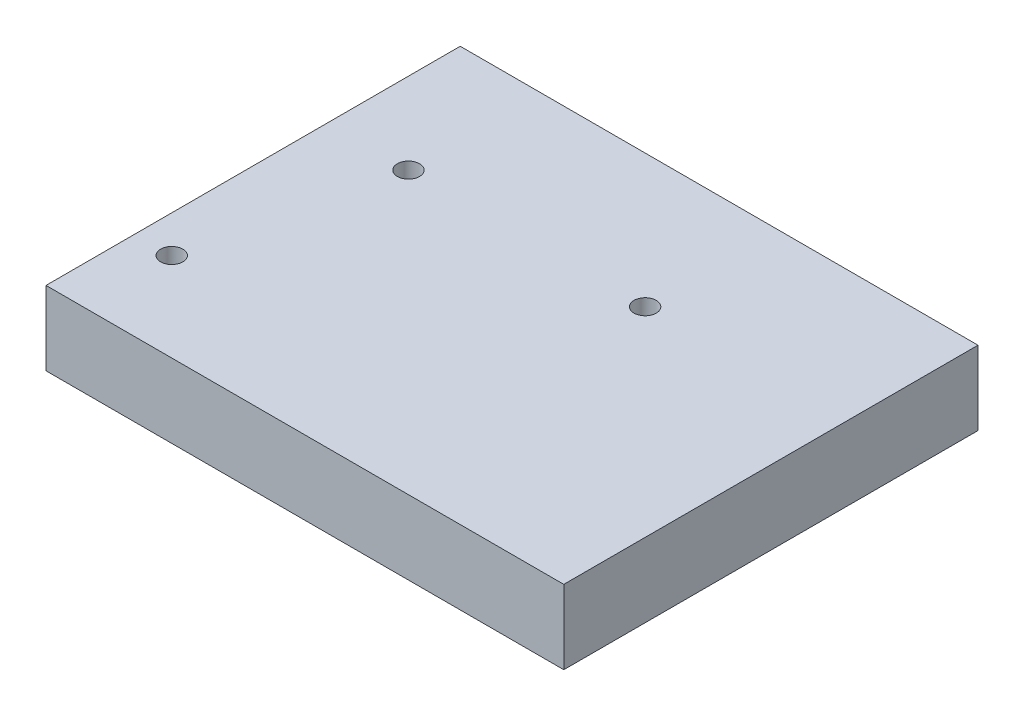
ISO-10303-21;
HEADER;
FILE_DESCRIPTION(('STEP AP214'),'2;1');
FILE_NAME('part.step','',(''),(''),'','','');
FILE_SCHEMA(('AUTOMOTIVE_DESIGN { 1 0 10303 214 1 1 1 1 }'));
ENDSEC;
DATA;
#1=APPLICATION_CONTEXT('core data for automotive mechanical design processes');
#2=APPLICATION_PROTOCOL_DEFINITION('international standard','automotive_design',2000,#1);
#3=PRODUCT_CONTEXT('',#1,'mechanical');
#4=PRODUCT('Part','Part','',(#3));
#5=PRODUCT_RELATED_PRODUCT_CATEGORY('part','',(#4));
#6=PRODUCT_DEFINITION_FORMATION('','',#4);
#7=PRODUCT_DEFINITION_CONTEXT('part definition',#1,'design');
#8=PRODUCT_DEFINITION('design','',#6,#7);
#9=PRODUCT_DEFINITION_SHAPE('','',#8);
#10=(LENGTH_UNIT() NAMED_UNIT(*) SI_UNIT(.MILLI.,.METRE.));
#11=(NAMED_UNIT(*) PLANE_ANGLE_UNIT() SI_UNIT($,.RADIAN.));
#12=(NAMED_UNIT(*) SI_UNIT($,.STERADIAN.) SOLID_ANGLE_UNIT());
#13=UNCERTAINTY_MEASURE_WITH_UNIT(LENGTH_MEASURE(1.E-05),#10,'distance_accuracy_value','');
#14=(GEOMETRIC_REPRESENTATION_CONTEXT(3) GLOBAL_UNCERTAINTY_ASSIGNED_CONTEXT((#13)) GLOBAL_UNIT_ASSIGNED_CONTEXT((#10,
#11,#12)) REPRESENTATION_CONTEXT('',''));
#15=CARTESIAN_POINT('',(0.,0.,0.));
#16=DIRECTION('',(0.,0.,1.));
#17=DIRECTION('',(1.,0.,0.));
#18=AXIS2_PLACEMENT_3D('',#15,#16,#17);
#19=CARTESIAN_POINT('',(35.,10.,-28.));
#20=DIRECTION('',(-1.,0.,0.));
#21=DIRECTION('',(0.,0.,1.));
#22=AXIS2_PLACEMENT_3D('',#19,#20,#21);
#23=PLANE('',#22);
#24=DIRECTION('',(0.,0.,-1.));
#25=VECTOR('',#24,1.);
#26=CARTESIAN_POINT('',(35.,0.,-28.));
#27=LINE('',#26,#25);
#28=CARTESIAN_POINT('',(35.,0.,28.));
#29=VERTEX_POINT('',#28);
#30=CARTESIAN_POINT('',(35.,0.,-28.));
#31=VERTEX_POINT('',#30);
#32=EDGE_CURVE('E102',#29,#31,#27,.T.);
#33=ORIENTED_EDGE('',*,*,#32,.T.);
#34=DIRECTION('',(0.,-1.,0.));
#35=VECTOR('',#34,1.);
#36=CARTESIAN_POINT('',(35.,10.,-28.));
#37=LINE('',#36,#35);
#38=CARTESIAN_POINT('',(35.,10.,-28.));
#39=VERTEX_POINT('',#38);
#40=EDGE_CURVE('E11',#39,#31,#37,.T.);
#41=ORIENTED_EDGE('',*,*,#40,.F.);
#42=DIRECTION('',(0.,0.,-1.));
#43=VECTOR('',#42,1.);
#44=CARTESIAN_POINT('',(35.,10.,-28.));
#45=LINE('',#44,#43);
#46=CARTESIAN_POINT('',(35.,10.,28.));
#47=VERTEX_POINT('',#46);
#48=EDGE_CURVE('E90',#47,#39,#45,.T.);
#49=ORIENTED_EDGE('',*,*,#48,.F.);
#50=DIRECTION('',(0.,-1.,0.));
#51=VECTOR('',#50,1.);
#52=CARTESIAN_POINT('',(35.,10.,28.));
#53=LINE('',#52,#51);
#54=EDGE_CURVE('E98',#47,#29,#53,.T.);
#55=ORIENTED_EDGE('',*,*,#54,.T.);
#56=EDGE_LOOP('',(#33,#41,#49,#55));
#57=FACE_BOUND('',#56,.T.);
#58=ADVANCED_FACE('F39',(#57),#23,.F.);
#59=CARTESIAN_POINT('',(-35.,10.,-28.));
#60=DIRECTION('',(0.,0.,1.));
#61=DIRECTION('',(1.,0.,0.));
#62=AXIS2_PLACEMENT_3D('',#59,#60,#61);
#63=PLANE('',#62);
#64=DIRECTION('',(-1.,0.,0.));
#65=VECTOR('',#64,1.);
#66=CARTESIAN_POINT('',(-35.,0.,-28.));
#67=LINE('',#66,#65);
#68=CARTESIAN_POINT('',(-35.,0.,-28.));
#69=VERTEX_POINT('',#68);
#70=EDGE_CURVE('E94',#31,#69,#67,.T.);
#71=ORIENTED_EDGE('',*,*,#70,.T.);
#72=DIRECTION('',(0.,-1.,0.));
#73=VECTOR('',#72,1.);
#74=CARTESIAN_POINT('',(-35.,10.,-28.));
#75=LINE('',#74,#73);
#76=CARTESIAN_POINT('',(-35.,10.,-28.));
#77=VERTEX_POINT('',#76);
#78=EDGE_CURVE('E47',#77,#69,#75,.T.);
#79=ORIENTED_EDGE('',*,*,#78,.F.);
#80=DIRECTION('',(-1.,0.,0.));
#81=VECTOR('',#80,1.);
#82=CARTESIAN_POINT('',(-35.,10.,-28.));
#83=LINE('',#82,#81);
#84=EDGE_CURVE('E85',#39,#77,#83,.T.);
#85=ORIENTED_EDGE('',*,*,#84,.F.);
#86=ORIENTED_EDGE('',*,*,#40,.T.);
#87=EDGE_LOOP('',(#71,#79,#85,#86));
#88=FACE_BOUND('',#87,.T.);
#89=ADVANCED_FACE('F93',(#88),#63,.F.);
#90=CARTESIAN_POINT('',(-35.,10.,-28.));
#91=DIRECTION('',(1.,0.,0.));
#92=DIRECTION('',(0.,0.,-1.));
#93=AXIS2_PLACEMENT_3D('',#90,#91,#92);
#94=PLANE('',#93);
#95=DIRECTION('',(0.,0.,1.));
#96=VECTOR('',#95,1.);
#97=CARTESIAN_POINT('',(-35.,0.,-28.));
#98=LINE('',#97,#96);
#99=CARTESIAN_POINT('',(-35.,0.,28.));
#100=VERTEX_POINT('',#99);
#101=EDGE_CURVE('E72',#69,#100,#98,.T.);
#102=ORIENTED_EDGE('',*,*,#101,.T.);
#103=DIRECTION('',(0.,-1.,0.));
#104=VECTOR('',#103,1.);
#105=CARTESIAN_POINT('',(-35.,10.,28.));
#106=LINE('',#105,#104);
#107=CARTESIAN_POINT('',(-35.,10.,28.));
#108=VERTEX_POINT('',#107);
#109=EDGE_CURVE('E95',#108,#100,#106,.T.);
#110=ORIENTED_EDGE('',*,*,#109,.F.);
#111=DIRECTION('',(0.,0.,1.));
#112=VECTOR('',#111,1.);
#113=CARTESIAN_POINT('',(-35.,10.,-28.));
#114=LINE('',#113,#112);
#115=EDGE_CURVE('E88',#77,#108,#114,.T.);
#116=ORIENTED_EDGE('',*,*,#115,.F.);
#117=ORIENTED_EDGE('',*,*,#78,.T.);
#118=EDGE_LOOP('',(#102,#110,#116,#117));
#119=FACE_BOUND('',#118,.T.);
#120=ADVANCED_FACE('F96',(#119),#94,.F.);
#121=CARTESIAN_POINT('',(-35.,10.,28.));
#122=DIRECTION('',(0.,0.,-1.));
#123=DIRECTION('',(-1.,0.,0.));
#124=AXIS2_PLACEMENT_3D('',#121,#122,#123);
#125=PLANE('',#124);
#126=DIRECTION('',(1.,0.,0.));
#127=VECTOR('',#126,1.);
#128=CARTESIAN_POINT('',(-35.,0.,28.));
#129=LINE('',#128,#127);
#130=EDGE_CURVE('E78',#100,#29,#129,.T.);
#131=ORIENTED_EDGE('',*,*,#130,.T.);
#132=ORIENTED_EDGE('',*,*,#54,.F.);
#133=DIRECTION('',(1.,0.,0.));
#134=VECTOR('',#133,1.);
#135=CARTESIAN_POINT('',(-35.,10.,28.));
#136=LINE('',#135,#134);
#137=EDGE_CURVE('E55',#108,#47,#136,.T.);
#138=ORIENTED_EDGE('',*,*,#137,.F.);
#139=ORIENTED_EDGE('',*,*,#109,.T.);
#140=EDGE_LOOP('',(#131,#132,#138,#139));
#141=FACE_BOUND('',#140,.T.);
#142=ADVANCED_FACE('F110',(#141),#125,.F.);
#143=CARTESIAN_POINT('',(0.,10.,0.));
#144=DIRECTION('',(0.,1.,0.));
#145=DIRECTION('',(0.,0.,1.));
#146=AXIS2_PLACEMENT_3D('',#143,#144,#145);
#147=PLANE('',#146);
#148=CARTESIAN_POINT('',(-30.,10.,16.));
#149=DIRECTION('',(0.,1.,0.));
#150=DIRECTION('',(0.,0.,1.));
#151=AXIS2_PLACEMENT_3D('',#148,#149,#150);
#152=CIRCLE('',#151,1.5);
#153=CARTESIAN_POINT('',(-30.,10.,17.5));
#154=VERTEX_POINT('',#153);
#155=EDGE_CURVE('E128',#154,#154,#152,.T.);
#156=ORIENTED_EDGE('',*,*,#155,.F.);
#157=EDGE_LOOP('',(#156));
#158=FACE_BOUND('',#157,.T.);
#159=CARTESIAN_POINT('',(-24.,10.,-10.));
#160=DIRECTION('',(0.,1.,0.));
#161=DIRECTION('',(0.,0.,1.));
#162=AXIS2_PLACEMENT_3D('',#159,#160,#161);
#163=CIRCLE('',#162,1.5);
#164=CARTESIAN_POINT('',(-24.,10.,-8.50000000000001));
#165=VERTEX_POINT('',#164);
#166=EDGE_CURVE('E125',#165,#165,#163,.T.);
#167=ORIENTED_EDGE('',*,*,#166,.F.);
#168=EDGE_LOOP('',(#167));
#169=FACE_BOUND('',#168,.T.);
#170=CARTESIAN_POINT('',(8.,10.,-10.));
#171=DIRECTION('',(0.,1.,0.));
#172=DIRECTION('',(0.,0.,1.));
#173=AXIS2_PLACEMENT_3D('',#170,#171,#172);
#174=CIRCLE('',#173,1.5);
#175=CARTESIAN_POINT('',(8.,10.,-8.50000000000001));
#176=VERTEX_POINT('',#175);
#177=EDGE_CURVE('E119',#176,#176,#174,.T.);
#178=ORIENTED_EDGE('',*,*,#177,.F.);
#179=EDGE_LOOP('',(#178));
#180=FACE_BOUND('',#179,.T.);
#181=ORIENTED_EDGE('',*,*,#48,.T.);
#182=ORIENTED_EDGE('',*,*,#84,.T.);
#183=ORIENTED_EDGE('',*,*,#115,.T.);
#184=ORIENTED_EDGE('',*,*,#137,.T.);
#185=EDGE_LOOP('',(#181,#182,#183,#184));
#186=FACE_BOUND('',#185,.T.);
#187=ADVANCED_FACE('F86',(#158,#169,#180,#186),#147,.T.);
#188=CARTESIAN_POINT('',(0.,0.,0.));
#189=DIRECTION('',(0.,1.,0.));
#190=DIRECTION('',(0.,0.,1.));
#191=AXIS2_PLACEMENT_3D('',#188,#189,#190);
#192=PLANE('',#191);
#193=CARTESIAN_POINT('',(-30.,0.,16.));
#194=DIRECTION('',(0.,1.,0.));
#195=DIRECTION('',(0.,0.,1.));
#196=AXIS2_PLACEMENT_3D('',#193,#194,#195);
#197=CIRCLE('',#196,1.5);
#198=CARTESIAN_POINT('',(-30.,0.,17.5));
#199=VERTEX_POINT('',#198);
#200=EDGE_CURVE('E105',#199,#199,#197,.T.);
#201=ORIENTED_EDGE('',*,*,#200,.T.);
#202=EDGE_LOOP('',(#201));
#203=FACE_BOUND('',#202,.T.);
#204=CARTESIAN_POINT('',(-24.,0.,-10.));
#205=DIRECTION('',(0.,1.,0.));
#206=DIRECTION('',(0.,0.,1.));
#207=AXIS2_PLACEMENT_3D('',#204,#205,#206);
#208=CIRCLE('',#207,1.5);
#209=CARTESIAN_POINT('',(-24.,0.,-8.50000000000001));
#210=VERTEX_POINT('',#209);
#211=EDGE_CURVE('E122',#210,#210,#208,.T.);
#212=ORIENTED_EDGE('',*,*,#211,.T.);
#213=EDGE_LOOP('',(#212));
#214=FACE_BOUND('',#213,.T.);
#215=CARTESIAN_POINT('',(8.,0.,-10.));
#216=DIRECTION('',(0.,1.,0.));
#217=DIRECTION('',(0.,0.,1.));
#218=AXIS2_PLACEMENT_3D('',#215,#216,#217);
#219=CIRCLE('',#218,1.5);
#220=CARTESIAN_POINT('',(8.,0.,-8.50000000000001));
#221=VERTEX_POINT('',#220);
#222=EDGE_CURVE('E116',#221,#221,#219,.T.);
#223=ORIENTED_EDGE('',*,*,#222,.T.);
#224=EDGE_LOOP('',(#223));
#225=FACE_BOUND('',#224,.T.);
#226=ORIENTED_EDGE('',*,*,#32,.F.);
#227=ORIENTED_EDGE('',*,*,#130,.F.);
#228=ORIENTED_EDGE('',*,*,#101,.F.);
#229=ORIENTED_EDGE('',*,*,#70,.F.);
#230=EDGE_LOOP('',(#226,#227,#228,#229));
#231=FACE_BOUND('',#230,.T.);
#232=ADVANCED_FACE('F113',(#203,#214,#225,#231),#192,.F.);
#233=CARTESIAN_POINT('',(8.,0.,-10.));
#234=DIRECTION('',(0.,1.,0.));
#235=DIRECTION('',(0.,0.,1.));
#236=AXIS2_PLACEMENT_3D('',#233,#234,#235);
#237=CYLINDRICAL_SURFACE('',#236,1.5);
#238=ORIENTED_EDGE('',*,*,#222,.F.);
#239=EDGE_LOOP('',(#238));
#240=FACE_BOUND('',#239,.T.);
#241=ORIENTED_EDGE('',*,*,#177,.T.);
#242=EDGE_LOOP('',(#241));
#243=FACE_BOUND('',#242,.T.);
#244=ADVANCED_FACE('F150',(#240,#243),#237,.F.);
#245=CARTESIAN_POINT('',(-24.,0.,-10.));
#246=DIRECTION('',(0.,1.,0.));
#247=DIRECTION('',(0.,0.,1.));
#248=AXIS2_PLACEMENT_3D('',#245,#246,#247);
#249=CYLINDRICAL_SURFACE('',#248,1.5);
#250=ORIENTED_EDGE('',*,*,#211,.F.);
#251=EDGE_LOOP('',(#250));
#252=FACE_BOUND('',#251,.T.);
#253=ORIENTED_EDGE('',*,*,#166,.T.);
#254=EDGE_LOOP('',(#253));
#255=FACE_BOUND('',#254,.T.);
#256=ADVANCED_FACE('F139',(#252,#255),#249,.F.);
#257=CARTESIAN_POINT('',(-30.,0.,16.));
#258=DIRECTION('',(0.,1.,0.));
#259=DIRECTION('',(0.,0.,1.));
#260=AXIS2_PLACEMENT_3D('',#257,#258,#259);
#261=CYLINDRICAL_SURFACE('',#260,1.5);
#262=ORIENTED_EDGE('',*,*,#200,.F.);
#263=EDGE_LOOP('',(#262));
#264=FACE_BOUND('',#263,.T.);
#265=ORIENTED_EDGE('',*,*,#155,.T.);
#266=EDGE_LOOP('',(#265));
#267=FACE_BOUND('',#266,.T.);
#268=ADVANCED_FACE('F136',(#264,#267),#261,.F.);
#269=CLOSED_SHELL('',(#58,#89,#120,#142,#187,#232,#244,#256,#268));
#270=MANIFOLD_SOLID_BREP('B2',#269);
#271=ADVANCED_BREP_SHAPE_REPRESENTATION('',(#18,#270),#14);
#272=SHAPE_DEFINITION_REPRESENTATION(#9,#271);
ENDSEC;
END-ISO-10303-21;
